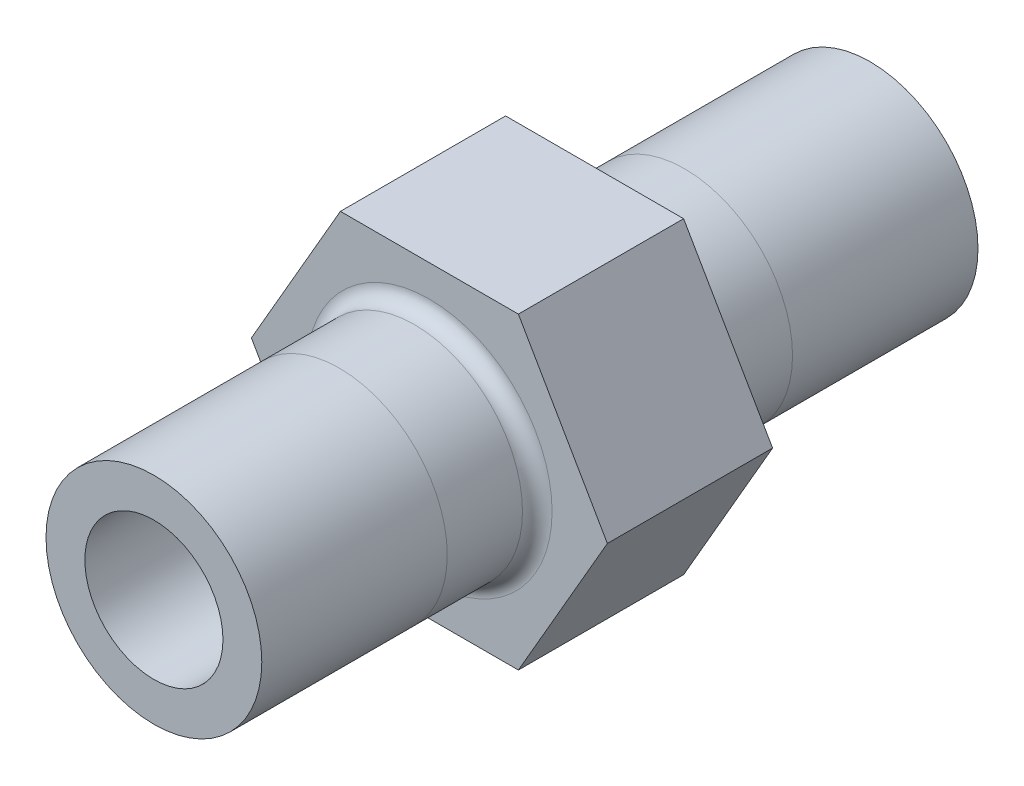
ISO-10303-21;
HEADER;
FILE_DESCRIPTION(('STEP AP214'),'2;1');
FILE_NAME('part.step','',(''),(''),'','','');
FILE_SCHEMA(('AUTOMOTIVE_DESIGN { 1 0 10303 214 1 1 1 1 }'));
ENDSEC;
DATA;
#1=APPLICATION_CONTEXT('core data for automotive mechanical design processes');
#2=APPLICATION_PROTOCOL_DEFINITION('international standard','automotive_design',2000,#1);
#3=PRODUCT_CONTEXT('',#1,'mechanical');
#4=PRODUCT('Part','Part','',(#3));
#5=PRODUCT_RELATED_PRODUCT_CATEGORY('part','',(#4));
#6=PRODUCT_DEFINITION_FORMATION('','',#4);
#7=PRODUCT_DEFINITION_CONTEXT('part definition',#1,'design');
#8=PRODUCT_DEFINITION('design','',#6,#7);
#9=PRODUCT_DEFINITION_SHAPE('','',#8);
#10=(LENGTH_UNIT() NAMED_UNIT(*) SI_UNIT(.MILLI.,.METRE.));
#11=(NAMED_UNIT(*) PLANE_ANGLE_UNIT() SI_UNIT($,.RADIAN.));
#12=(NAMED_UNIT(*) SI_UNIT($,.STERADIAN.) SOLID_ANGLE_UNIT());
#13=UNCERTAINTY_MEASURE_WITH_UNIT(LENGTH_MEASURE(1.E-05),#10,'distance_accuracy_value','');
#14=(GEOMETRIC_REPRESENTATION_CONTEXT(3) GLOBAL_UNCERTAINTY_ASSIGNED_CONTEXT((#13)) GLOBAL_UNIT_ASSIGNED_CONTEXT((#10,
#11,#12)) REPRESENTATION_CONTEXT('',''));
#15=CARTESIAN_POINT('',(0.,0.,0.));
#16=DIRECTION('',(0.,0.,1.));
#17=DIRECTION('',(1.,0.,0.));
#18=AXIS2_PLACEMENT_3D('',#15,#16,#17);
#19=CARTESIAN_POINT('',(0.,0.,18.4404));
#20=DIRECTION('',(0.,0.,-1.));
#21=DIRECTION('',(-1.,0.,0.));
#22=AXIS2_PLACEMENT_3D('',#19,#20,#21);
#23=CYLINDRICAL_SURFACE('',#22,5.55625);
#24=CARTESIAN_POINT('',(0.,0.,-5.0165));
#25=DIRECTION('',(0.,0.,1.));
#26=DIRECTION('',(1.,0.,0.));
#27=AXIS2_PLACEMENT_3D('',#24,#25,#26);
#28=CIRCLE('',#27,5.55625);
#29=CARTESIAN_POINT('',(5.55625,0.,-5.0165));
#30=VERTEX_POINT('',#29);
#31=EDGE_CURVE('E182',#30,#30,#28,.F.);
#32=ORIENTED_EDGE('',*,*,#31,.T.);
#33=EDGE_LOOP('',(#32));
#34=FACE_BOUND('',#33,.T.);
#35=CARTESIAN_POINT('',(0.,0.,-8.89));
#36=DIRECTION('',(0.,0.,1.));
#37=DIRECTION('',(1.,0.,0.));
#38=AXIS2_PLACEMENT_3D('',#35,#36,#37);
#39=CIRCLE('',#38,5.55625);
#40=CARTESIAN_POINT('',(5.55625,0.,-8.89));
#41=VERTEX_POINT('',#40);
#42=EDGE_CURVE('E12',#41,#41,#39,.T.);
#43=ORIENTED_EDGE('',*,*,#42,.T.);
#44=EDGE_LOOP('',(#43));
#45=FACE_BOUND('',#44,.T.);
#46=ADVANCED_FACE('F48',(#34,#45),#23,.T.);
#47=CARTESIAN_POINT('',(0.,0.,18.4404));
#48=DIRECTION('',(0.,0.,1.));
#49=DIRECTION('',(1.,0.,0.));
#50=AXIS2_PLACEMENT_3D('',#47,#48,#49);
#51=CIRCLE('',#50,5.55625);
#52=CARTESIAN_POINT('',(5.55625,0.,18.4404));
#53=VERTEX_POINT('',#52);
#54=EDGE_CURVE('E171',#53,#53,#51,.T.);
#55=ORIENTED_EDGE('',*,*,#54,.F.);
#56=EDGE_LOOP('',(#55));
#57=FACE_BOUND('',#56,.T.);
#58=CARTESIAN_POINT('',(0.,0.,8.89));
#59=DIRECTION('',(0.,0.,1.));
#60=DIRECTION('',(1.,0.,0.));
#61=AXIS2_PLACEMENT_3D('',#58,#59,#60);
#62=CIRCLE('',#61,5.55625);
#63=CARTESIAN_POINT('',(5.55625,0.,8.89));
#64=VERTEX_POINT('',#63);
#65=EDGE_CURVE('E58',#64,#64,#62,.T.);
#66=ORIENTED_EDGE('',*,*,#65,.T.);
#67=EDGE_LOOP('',(#66));
#68=FACE_BOUND('',#67,.T.);
#69=ADVANCED_FACE('F197',(#57,#68),#23,.T.);
#70=ORIENTED_EDGE('',*,*,#65,.F.);
#71=EDGE_LOOP('',(#70));
#72=FACE_BOUND('',#71,.T.);
#73=CARTESIAN_POINT('',(0.,0.,5.0165));
#74=DIRECTION('',(0.,0.,1.));
#75=DIRECTION('',(1.,0.,0.));
#76=AXIS2_PLACEMENT_3D('',#73,#74,#75);
#77=CIRCLE('',#76,5.55625);
#78=CARTESIAN_POINT('',(5.55625,0.,5.0165));
#79=VERTEX_POINT('',#78);
#80=EDGE_CURVE('E186',#79,#79,#77,.T.);
#81=ORIENTED_EDGE('',*,*,#80,.T.);
#82=EDGE_LOOP('',(#81));
#83=FACE_BOUND('',#82,.T.);
#84=ADVANCED_FACE('F199',(#72,#83),#23,.T.);
#85=CARTESIAN_POINT('',(0.,0.,18.4404));
#86=DIRECTION('',(0.,0.,1.));
#87=DIRECTION('',(1.,0.,0.));
#88=AXIS2_PLACEMENT_3D('',#85,#86,#87);
#89=PLANE('',#88);
#90=CARTESIAN_POINT('',(0.,0.,18.4404));
#91=DIRECTION('',(0.,0.,1.));
#92=DIRECTION('',(1.,0.,0.));
#93=AXIS2_PLACEMENT_3D('',#90,#91,#92);
#94=CIRCLE('',#93,3.556);
#95=CARTESIAN_POINT('',(3.556,0.,18.4404));
#96=VERTEX_POINT('',#95);
#97=EDGE_CURVE('E267',#96,#96,#94,.T.);
#98=ORIENTED_EDGE('',*,*,#97,.F.);
#99=EDGE_LOOP('',(#98));
#100=FACE_BOUND('',#99,.T.);
#101=ORIENTED_EDGE('',*,*,#54,.T.);
#102=EDGE_LOOP('',(#101));
#103=FACE_BOUND('',#102,.T.);
#104=ADVANCED_FACE('F202',(#100,#103),#89,.T.);
#105=CARTESIAN_POINT('',(4.58271776169266,-7.9375,4.2545));
#106=DIRECTION('',(-0.866025403784439,0.5,0.));
#107=DIRECTION('',(-0.5,-0.866025403784439,0.));
#108=AXIS2_PLACEMENT_3D('',#105,#106,#107);
#109=PLANE('',#108);
#110=DIRECTION('',(0.5,0.866025403784439,0.));
#111=VECTOR('',#110,1.);
#112=CARTESIAN_POINT('',(4.58271776169266,-7.9375,-4.2545));
#113=LINE('',#112,#111);
#114=CARTESIAN_POINT('',(4.58271776169266,-7.9375,-4.2545));
#115=VERTEX_POINT('',#114);
#116=CARTESIAN_POINT('',(9.16543552338531,0.,-4.2545));
#117=VERTEX_POINT('',#116);
#118=EDGE_CURVE('E139',#115,#117,#113,.T.);
#119=ORIENTED_EDGE('',*,*,#118,.T.);
#120=DIRECTION('',(0.,0.,-1.));
#121=VECTOR('',#120,1.);
#122=CARTESIAN_POINT('',(9.16543552338531,0.,4.2545));
#123=LINE('',#122,#121);
#124=CARTESIAN_POINT('',(9.16543552338531,0.,4.2545));
#125=VERTEX_POINT('',#124);
#126=EDGE_CURVE('E167',#125,#117,#123,.T.);
#127=ORIENTED_EDGE('',*,*,#126,.F.);
#128=DIRECTION('',(0.5,0.866025403784439,0.));
#129=VECTOR('',#128,1.);
#130=CARTESIAN_POINT('',(4.58271776169266,-7.9375,4.2545));
#131=LINE('',#130,#129);
#132=CARTESIAN_POINT('',(4.58271776169266,-7.9375,4.2545));
#133=VERTEX_POINT('',#132);
#134=EDGE_CURVE('E156',#133,#125,#131,.T.);
#135=ORIENTED_EDGE('',*,*,#134,.F.);
#136=DIRECTION('',(0.,0.,-1.));
#137=VECTOR('',#136,1.);
#138=CARTESIAN_POINT('',(4.58271776169266,-7.9375,4.2545));
#139=LINE('',#138,#137);
#140=EDGE_CURVE('E135',#133,#115,#139,.T.);
#141=ORIENTED_EDGE('',*,*,#140,.T.);
#142=EDGE_LOOP('',(#119,#127,#135,#141));
#143=FACE_BOUND('',#142,.T.);
#144=ADVANCED_FACE('F231',(#143),#109,.F.);
#145=CARTESIAN_POINT('',(9.16543552338531,0.,4.2545));
#146=DIRECTION('',(-0.866025403784439,-0.5,0.));
#147=DIRECTION('',(0.5,-0.866025403784439,0.));
#148=AXIS2_PLACEMENT_3D('',#145,#146,#147);
#149=PLANE('',#148);
#150=DIRECTION('',(-0.5,0.866025403784438,0.));
#151=VECTOR('',#150,1.);
#152=CARTESIAN_POINT('',(9.16543552338531,0.,-4.2545));
#153=LINE('',#152,#151);
#154=CARTESIAN_POINT('',(4.58271776169265,7.9375,-4.2545));
#155=VERTEX_POINT('',#154);
#156=EDGE_CURVE('E143',#117,#155,#153,.T.);
#157=ORIENTED_EDGE('',*,*,#156,.T.);
#158=DIRECTION('',(0.,0.,-1.));
#159=VECTOR('',#158,1.);
#160=CARTESIAN_POINT('',(4.58271776169265,7.9375,4.2545));
#161=LINE('',#160,#159);
#162=CARTESIAN_POINT('',(4.58271776169265,7.9375,4.2545));
#163=VERTEX_POINT('',#162);
#164=EDGE_CURVE('E163',#163,#155,#161,.T.);
#165=ORIENTED_EDGE('',*,*,#164,.F.);
#166=DIRECTION('',(-0.5,0.866025403784438,0.));
#167=VECTOR('',#166,1.);
#168=CARTESIAN_POINT('',(9.16543552338531,0.,4.2545));
#169=LINE('',#168,#167);
#170=EDGE_CURVE('E104',#125,#163,#169,.T.);
#171=ORIENTED_EDGE('',*,*,#170,.F.);
#172=ORIENTED_EDGE('',*,*,#126,.T.);
#173=EDGE_LOOP('',(#157,#165,#171,#172));
#174=FACE_BOUND('',#173,.T.);
#175=ADVANCED_FACE('F235',(#174),#149,.F.);
#176=CARTESIAN_POINT('',(4.58271776169265,7.9375,4.2545));
#177=DIRECTION('',(0.,-1.,0.));
#178=DIRECTION('',(0.,0.,-1.));
#179=AXIS2_PLACEMENT_3D('',#176,#177,#178);
#180=PLANE('',#179);
#181=DIRECTION('',(-1.,0.,0.));
#182=VECTOR('',#181,1.);
#183=CARTESIAN_POINT('',(4.58271776169265,7.9375,-4.2545));
#184=LINE('',#183,#182);
#185=CARTESIAN_POINT('',(-4.58271776169265,7.9375,-4.2545));
#186=VERTEX_POINT('',#185);
#187=EDGE_CURVE('E147',#155,#186,#184,.T.);
#188=ORIENTED_EDGE('',*,*,#187,.T.);
#189=DIRECTION('',(0.,0.,-1.));
#190=VECTOR('',#189,1.);
#191=CARTESIAN_POINT('',(-4.58271776169265,7.9375,4.2545));
#192=LINE('',#191,#190);
#193=CARTESIAN_POINT('',(-4.58271776169265,7.9375,4.2545));
#194=VERTEX_POINT('',#193);
#195=EDGE_CURVE('E128',#194,#186,#192,.T.);
#196=ORIENTED_EDGE('',*,*,#195,.F.);
#197=DIRECTION('',(-1.,0.,0.));
#198=VECTOR('',#197,1.);
#199=CARTESIAN_POINT('',(4.58271776169265,7.9375,4.2545));
#200=LINE('',#199,#198);
#201=EDGE_CURVE('E117',#163,#194,#200,.T.);
#202=ORIENTED_EDGE('',*,*,#201,.F.);
#203=ORIENTED_EDGE('',*,*,#164,.T.);
#204=EDGE_LOOP('',(#188,#196,#202,#203));
#205=FACE_BOUND('',#204,.T.);
#206=ADVANCED_FACE('F239',(#205),#180,.F.);
#207=CARTESIAN_POINT('',(-4.58271776169265,7.9375,4.2545));
#208=DIRECTION('',(0.866025403784439,-0.5,0.));
#209=DIRECTION('',(0.5,0.866025403784439,0.));
#210=AXIS2_PLACEMENT_3D('',#207,#208,#209);
#211=PLANE('',#210);
#212=DIRECTION('',(-0.5,-0.866025403784439,0.));
#213=VECTOR('',#212,1.);
#214=CARTESIAN_POINT('',(-4.58271776169265,7.9375,-4.2545));
#215=LINE('',#214,#213);
#216=CARTESIAN_POINT('',(-9.16543552338531,0.,-4.2545));
#217=VERTEX_POINT('',#216);
#218=EDGE_CURVE('E126',#186,#217,#215,.T.);
#219=ORIENTED_EDGE('',*,*,#218,.T.);
#220=DIRECTION('',(0.,0.,-1.));
#221=VECTOR('',#220,1.);
#222=CARTESIAN_POINT('',(-9.16543552338531,0.,4.2545));
#223=LINE('',#222,#221);
#224=CARTESIAN_POINT('',(-9.16543552338531,0.,4.2545));
#225=VERTEX_POINT('',#224);
#226=EDGE_CURVE('E123',#225,#217,#223,.T.);
#227=ORIENTED_EDGE('',*,*,#226,.F.);
#228=DIRECTION('',(-0.5,-0.866025403784439,0.));
#229=VECTOR('',#228,1.);
#230=CARTESIAN_POINT('',(-4.58271776169265,7.9375,4.2545));
#231=LINE('',#230,#229);
#232=EDGE_CURVE('E111',#194,#225,#231,.T.);
#233=ORIENTED_EDGE('',*,*,#232,.F.);
#234=ORIENTED_EDGE('',*,*,#195,.T.);
#235=EDGE_LOOP('',(#219,#227,#233,#234));
#236=FACE_BOUND('',#235,.T.);
#237=ADVANCED_FACE('F124',(#236),#211,.F.);
#238=CARTESIAN_POINT('',(-9.16543552338531,0.,4.2545));
#239=DIRECTION('',(0.866025403784439,0.5,0.));
#240=DIRECTION('',(-0.5,0.866025403784439,0.));
#241=AXIS2_PLACEMENT_3D('',#238,#239,#240);
#242=PLANE('',#241);
#243=DIRECTION('',(0.5,-0.866025403784439,0.));
#244=VECTOR('',#243,1.);
#245=CARTESIAN_POINT('',(-9.16543552338531,0.,-4.2545));
#246=LINE('',#245,#244);
#247=CARTESIAN_POINT('',(-4.58271776169265,-7.9375,-4.2545));
#248=VERTEX_POINT('',#247);
#249=EDGE_CURVE('E89',#217,#248,#246,.T.);
#250=ORIENTED_EDGE('',*,*,#249,.T.);
#251=DIRECTION('',(0.,0.,-1.));
#252=VECTOR('',#251,1.);
#253=CARTESIAN_POINT('',(-4.58271776169265,-7.9375,4.2545));
#254=LINE('',#253,#252);
#255=CARTESIAN_POINT('',(-4.58271776169265,-7.9375,4.2545));
#256=VERTEX_POINT('',#255);
#257=EDGE_CURVE('E129',#256,#248,#254,.T.);
#258=ORIENTED_EDGE('',*,*,#257,.F.);
#259=DIRECTION('',(0.5,-0.866025403784439,0.));
#260=VECTOR('',#259,1.);
#261=CARTESIAN_POINT('',(-9.16543552338531,0.,4.2545));
#262=LINE('',#261,#260);
#263=EDGE_CURVE('E115',#225,#256,#262,.T.);
#264=ORIENTED_EDGE('',*,*,#263,.F.);
#265=ORIENTED_EDGE('',*,*,#226,.T.);
#266=EDGE_LOOP('',(#250,#258,#264,#265));
#267=FACE_BOUND('',#266,.T.);
#268=ADVANCED_FACE('F131',(#267),#242,.F.);
#269=CARTESIAN_POINT('',(-4.58271776169265,-7.9375,4.2545));
#270=DIRECTION('',(0.,1.,0.));
#271=DIRECTION('',(0.,0.,1.));
#272=AXIS2_PLACEMENT_3D('',#269,#270,#271);
#273=PLANE('',#272);
#274=DIRECTION('',(1.,0.,0.));
#275=VECTOR('',#274,1.);
#276=CARTESIAN_POINT('',(-4.58271776169265,-7.9375,-4.2545));
#277=LINE('',#276,#275);
#278=EDGE_CURVE('E95',#248,#115,#277,.T.);
#279=ORIENTED_EDGE('',*,*,#278,.T.);
#280=ORIENTED_EDGE('',*,*,#140,.F.);
#281=DIRECTION('',(1.,0.,0.));
#282=VECTOR('',#281,1.);
#283=CARTESIAN_POINT('',(-4.58271776169265,-7.9375,4.2545));
#284=LINE('',#283,#282);
#285=EDGE_CURVE('E66',#256,#133,#284,.T.);
#286=ORIENTED_EDGE('',*,*,#285,.F.);
#287=ORIENTED_EDGE('',*,*,#257,.T.);
#288=EDGE_LOOP('',(#279,#280,#286,#287));
#289=FACE_BOUND('',#288,.T.);
#290=ADVANCED_FACE('F247',(#289),#273,.F.);
#291=CARTESIAN_POINT('',(0.,0.,4.2545));
#292=DIRECTION('',(0.,0.,1.));
#293=DIRECTION('',(1.,0.,0.));
#294=AXIS2_PLACEMENT_3D('',#291,#292,#293);
#295=PLANE('',#294);
#296=CARTESIAN_POINT('',(0.,0.,4.2545));
#297=DIRECTION('',(0.,0.,1.));
#298=DIRECTION('',(1.,0.,0.));
#299=AXIS2_PLACEMENT_3D('',#296,#297,#298);
#300=CIRCLE('',#299,6.31825);
#301=CARTESIAN_POINT('',(6.31825,0.,4.2545));
#302=VERTEX_POINT('',#301);
#303=EDGE_CURVE('E190',#302,#302,#300,.F.);
#304=ORIENTED_EDGE('',*,*,#303,.T.);
#305=EDGE_LOOP('',(#304));
#306=FACE_BOUND('',#305,.T.);
#307=ORIENTED_EDGE('',*,*,#134,.T.);
#308=ORIENTED_EDGE('',*,*,#170,.T.);
#309=ORIENTED_EDGE('',*,*,#201,.T.);
#310=ORIENTED_EDGE('',*,*,#232,.T.);
#311=ORIENTED_EDGE('',*,*,#263,.T.);
#312=ORIENTED_EDGE('',*,*,#285,.T.);
#313=EDGE_LOOP('',(#307,#308,#309,#310,#311,#312));
#314=FACE_BOUND('',#313,.T.);
#315=ADVANCED_FACE('F113',(#306,#314),#295,.T.);
#316=CARTESIAN_POINT('',(0.,0.,-4.2545));
#317=DIRECTION('',(0.,0.,1.));
#318=DIRECTION('',(1.,0.,0.));
#319=AXIS2_PLACEMENT_3D('',#316,#317,#318);
#320=PLANE('',#319);
#321=CARTESIAN_POINT('',(0.,0.,-4.2545));
#322=DIRECTION('',(0.,0.,1.));
#323=DIRECTION('',(1.,0.,0.));
#324=AXIS2_PLACEMENT_3D('',#321,#322,#323);
#325=CIRCLE('',#324,6.31825);
#326=CARTESIAN_POINT('',(6.31825,0.,-4.2545));
#327=VERTEX_POINT('',#326);
#328=EDGE_CURVE('E175',#327,#327,#325,.T.);
#329=ORIENTED_EDGE('',*,*,#328,.T.);
#330=EDGE_LOOP('',(#329));
#331=FACE_BOUND('',#330,.T.);
#332=ORIENTED_EDGE('',*,*,#118,.F.);
#333=ORIENTED_EDGE('',*,*,#278,.F.);
#334=ORIENTED_EDGE('',*,*,#249,.F.);
#335=ORIENTED_EDGE('',*,*,#218,.F.);
#336=ORIENTED_EDGE('',*,*,#187,.F.);
#337=ORIENTED_EDGE('',*,*,#156,.F.);
#338=EDGE_LOOP('',(#332,#333,#334,#335,#336,#337));
#339=FACE_BOUND('',#338,.T.);
#340=ADVANCED_FACE('F227',(#331,#339),#320,.F.);
#341=CARTESIAN_POINT('',(0.,0.,-18.4404));
#342=DIRECTION('',(0.,0.,1.));
#343=DIRECTION('',(1.,0.,0.));
#344=AXIS2_PLACEMENT_3D('',#341,#342,#343);
#345=PLANE('',#344);
#346=CARTESIAN_POINT('',(0.,0.,-18.4404));
#347=DIRECTION('',(0.,0.,1.));
#348=DIRECTION('',(1.,0.,0.));
#349=AXIS2_PLACEMENT_3D('',#346,#347,#348);
#350=CIRCLE('',#349,3.556);
#351=CARTESIAN_POINT('',(3.556,0.,-18.4404));
#352=VERTEX_POINT('',#351);
#353=EDGE_CURVE('E144',#352,#352,#350,.T.);
#354=ORIENTED_EDGE('',*,*,#353,.T.);
#355=EDGE_LOOP('',(#354));
#356=FACE_BOUND('',#355,.T.);
#357=CARTESIAN_POINT('',(0.,0.,-18.4404));
#358=DIRECTION('',(0.,0.,1.));
#359=DIRECTION('',(1.,0.,0.));
#360=AXIS2_PLACEMENT_3D('',#357,#358,#359);
#361=CIRCLE('',#360,5.55625);
#362=CARTESIAN_POINT('',(5.55625,0.,-18.4404));
#363=VERTEX_POINT('',#362);
#364=EDGE_CURVE('E170',#363,#363,#361,.T.);
#365=ORIENTED_EDGE('',*,*,#364,.F.);
#366=EDGE_LOOP('',(#365));
#367=FACE_BOUND('',#366,.T.);
#368=ADVANCED_FACE('F224',(#356,#367),#345,.F.);
#369=ORIENTED_EDGE('',*,*,#42,.F.);
#370=EDGE_LOOP('',(#369));
#371=FACE_BOUND('',#370,.T.);
#372=ORIENTED_EDGE('',*,*,#364,.T.);
#373=EDGE_LOOP('',(#372));
#374=FACE_BOUND('',#373,.T.);
#375=ADVANCED_FACE('F204',(#371,#374),#23,.T.);
#376=CARTESIAN_POINT('',(0.,0.,-18.4404));
#377=DIRECTION('',(0.,0.,1.));
#378=DIRECTION('',(1.,0.,0.));
#379=AXIS2_PLACEMENT_3D('',#376,#377,#378);
#380=CYLINDRICAL_SURFACE('',#379,3.556);
#381=ORIENTED_EDGE('',*,*,#353,.F.);
#382=EDGE_LOOP('',(#381));
#383=FACE_BOUND('',#382,.T.);
#384=ORIENTED_EDGE('',*,*,#97,.T.);
#385=EDGE_LOOP('',(#384));
#386=FACE_BOUND('',#385,.T.);
#387=ADVANCED_FACE('F213',(#383,#386),#380,.F.);
#388=CARTESIAN_POINT('',(0.,0.,-5.0165));
#389=DIRECTION('',(0.,0.,1.));
#390=DIRECTION('',(1.,0.,0.));
#391=AXIS2_PLACEMENT_3D('',#388,#389,#390);
#392=TOROIDAL_SURFACE('',#391,6.31825,0.762);
#393=ORIENTED_EDGE('',*,*,#31,.F.);
#394=EDGE_LOOP('',(#393));
#395=FACE_BOUND('',#394,.T.);
#396=ORIENTED_EDGE('',*,*,#328,.F.);
#397=EDGE_LOOP('',(#396));
#398=FACE_BOUND('',#397,.T.);
#399=ADVANCED_FACE('F208',(#395,#398),#392,.F.);
#400=CARTESIAN_POINT('',(0.,0.,5.0165));
#401=DIRECTION('',(0.,0.,1.));
#402=DIRECTION('',(1.,0.,0.));
#403=AXIS2_PLACEMENT_3D('',#400,#401,#402);
#404=TOROIDAL_SURFACE('',#403,6.31825,0.762);
#405=ORIENTED_EDGE('',*,*,#303,.F.);
#406=EDGE_LOOP('',(#405));
#407=FACE_BOUND('',#406,.T.);
#408=ORIENTED_EDGE('',*,*,#80,.F.);
#409=EDGE_LOOP('',(#408));
#410=FACE_BOUND('',#409,.T.);
#411=ADVANCED_FACE('F50',(#407,#410),#404,.F.);
#412=CLOSED_SHELL('',(#46,#69,#84,#104,#144,#175,#206,#237,#268,#290,#315,#340,#368,#375,#387,
#399,#411));
#413=MANIFOLD_SOLID_BREP('B2',#412);
#414=ADVANCED_BREP_SHAPE_REPRESENTATION('',(#18,#413),#14);
#415=SHAPE_DEFINITION_REPRESENTATION(#9,#414);
ENDSEC;
END-ISO-10303-21;
